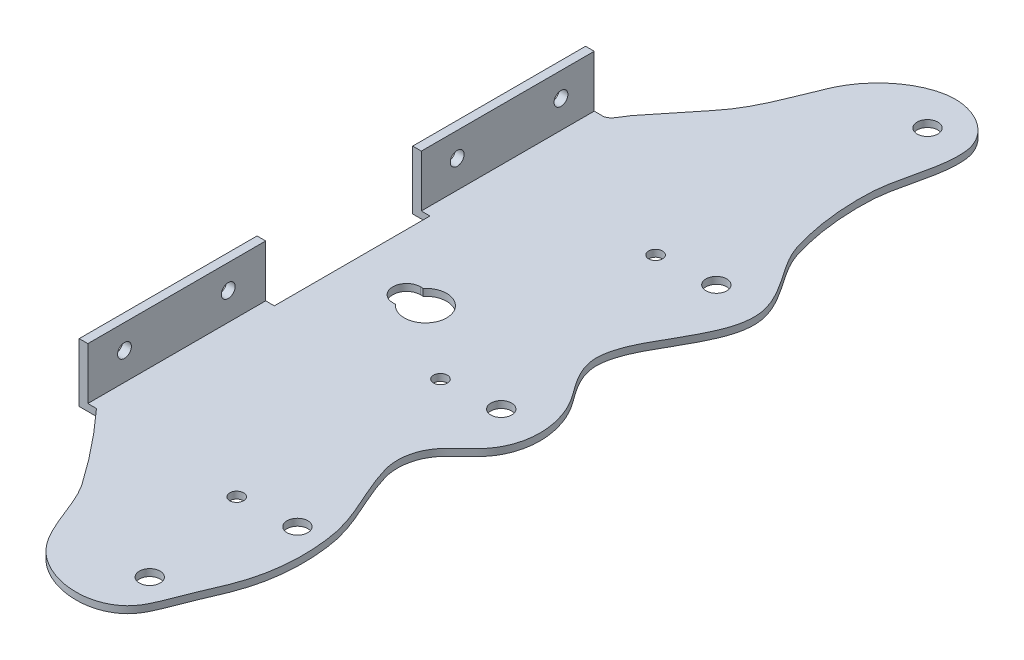
ISO-10303-21;
HEADER;
FILE_DESCRIPTION(('STEP AP214'),'2;1');
FILE_NAME('part.step','',(''),(''),'','','');
FILE_SCHEMA(('AUTOMOTIVE_DESIGN { 1 0 10303 214 1 1 1 1 }'));
ENDSEC;
DATA;
#1=APPLICATION_CONTEXT('core data for automotive mechanical design processes');
#2=APPLICATION_PROTOCOL_DEFINITION('international standard','automotive_design',2000,#1);
#3=PRODUCT_CONTEXT('',#1,'mechanical');
#4=PRODUCT('Part','Part','',(#3));
#5=PRODUCT_RELATED_PRODUCT_CATEGORY('part','',(#4));
#6=PRODUCT_DEFINITION_FORMATION('','',#4);
#7=PRODUCT_DEFINITION_CONTEXT('part definition',#1,'design');
#8=PRODUCT_DEFINITION('design','',#6,#7);
#9=PRODUCT_DEFINITION_SHAPE('','',#8);
#10=(LENGTH_UNIT() NAMED_UNIT(*) SI_UNIT(.MILLI.,.METRE.));
#11=(NAMED_UNIT(*) PLANE_ANGLE_UNIT() SI_UNIT($,.RADIAN.));
#12=(NAMED_UNIT(*) SI_UNIT($,.STERADIAN.) SOLID_ANGLE_UNIT());
#13=UNCERTAINTY_MEASURE_WITH_UNIT(LENGTH_MEASURE(1.E-05),#10,'distance_accuracy_value','');
#14=(GEOMETRIC_REPRESENTATION_CONTEXT(3) GLOBAL_UNCERTAINTY_ASSIGNED_CONTEXT((#13)) GLOBAL_UNIT_ASSIGNED_CONTEXT((#10,
#11,#12)) REPRESENTATION_CONTEXT('',''));
#15=CARTESIAN_POINT('',(0.,0.,0.));
#16=DIRECTION('',(0.,0.,1.));
#17=DIRECTION('',(1.,0.,0.));
#18=AXIS2_PLACEMENT_3D('',#15,#16,#17);
#19=CARTESIAN_POINT('',(255.661074439726,2.,-1028.80563383513));
#20=DIRECTION('',(0.,-1.,0.));
#21=DIRECTION('',(0.,0.,-1.));
#22=AXIS2_PLACEMENT_3D('',#19,#20,#21);
#23=PLANE('',#22);
#24=CARTESIAN_POINT('',(454.197507278282,2.,-1130.7574095105));
#25=DIRECTION('',(0.,1.,0.));
#26=DIRECTION('',(0.,0.,1.));
#27=AXIS2_PLACEMENT_3D('',#24,#25,#26);
#28=CIRCLE('',#27,2.99999999999999);
#29=CARTESIAN_POINT('',(454.197507278282,2.,-1127.7574095105));
#30=VERTEX_POINT('',#29);
#31=EDGE_CURVE('E478',#30,#30,#28,.T.);
#32=ORIENTED_EDGE('',*,*,#31,.F.);
#33=EDGE_LOOP('',(#32));
#34=FACE_BOUND('',#33,.T.);
#35=CARTESIAN_POINT('',(462.939861939,2.,-1164.71408522884));
#36=DIRECTION('',(0.,1.,0.));
#37=DIRECTION('',(0.,0.,1.));
#38=AXIS2_PLACEMENT_3D('',#35,#36,#37);
#39=CIRCLE('',#38,2.99999999999999);
#40=CARTESIAN_POINT('',(462.939861939,2.,-1161.71408522884));
#41=VERTEX_POINT('',#40);
#42=EDGE_CURVE('E472',#41,#41,#39,.T.);
#43=ORIENTED_EDGE('',*,*,#42,.F.);
#44=EDGE_LOOP('',(#43));
#45=FACE_BOUND('',#44,.T.);
#46=CARTESIAN_POINT('',(462.939861939,2.,-1223.64910089011));
#47=DIRECTION('',(0.,1.,0.));
#48=DIRECTION('',(0.,0.,1.));
#49=AXIS2_PLACEMENT_3D('',#46,#47,#48);
#50=CIRCLE('',#49,2.99999999999999);
#51=CARTESIAN_POINT('',(462.939861939,2.,-1220.64910089011));
#52=VERTEX_POINT('',#51);
#53=EDGE_CURVE('E469',#52,#52,#50,.T.);
#54=ORIENTED_EDGE('',*,*,#53,.F.);
#55=EDGE_LOOP('',(#54));
#56=FACE_BOUND('',#55,.T.);
#57=CARTESIAN_POINT('',(462.939861939,2.,-1285.84435146029));
#58=DIRECTION('',(0.,1.,0.));
#59=DIRECTION('',(0.,0.,1.));
#60=AXIS2_PLACEMENT_3D('',#57,#58,#59);
#61=CIRCLE('',#60,2.99999999999999);
#62=CARTESIAN_POINT('',(462.939861939,2.,-1282.84435146029));
#63=VERTEX_POINT('',#62);
#64=EDGE_CURVE('E473',#63,#63,#61,.T.);
#65=ORIENTED_EDGE('',*,*,#64,.F.);
#66=EDGE_LOOP('',(#65));
#67=FACE_BOUND('',#66,.T.);
#68=CARTESIAN_POINT('',(454.197507278282,2.,-1355.62910089056));
#69=DIRECTION('',(0.,1.,0.));
#70=DIRECTION('',(0.,0.,1.));
#71=AXIS2_PLACEMENT_3D('',#68,#69,#70);
#72=CIRCLE('',#71,2.99999999999999);
#73=CARTESIAN_POINT('',(454.197507278282,2.,-1352.62910089056));
#74=VERTEX_POINT('',#73);
#75=EDGE_CURVE('E481',#74,#74,#72,.T.);
#76=ORIENTED_EDGE('',*,*,#75,.F.);
#77=EDGE_LOOP('',(#76));
#78=FACE_BOUND('',#77,.T.);
#79=CARTESIAN_POINT('',(446.65971355284,2.,-1222.36199710261));
#80=DIRECTION('',(0.,1.,0.));
#81=DIRECTION('',(0.,0.,1.));
#82=AXIS2_PLACEMENT_3D('',#79,#80,#81);
#83=CIRCLE('',#82,2.);
#84=CARTESIAN_POINT('',(446.65971355284,2.,-1220.36199710261));
#85=VERTEX_POINT('',#84);
#86=EDGE_CURVE('E535',#85,#85,#83,.T.);
#87=ORIENTED_EDGE('',*,*,#86,.F.);
#88=EDGE_LOOP('',(#87));
#89=FACE_BOUND('',#88,.T.);
#90=CARTESIAN_POINT('',(446.65971355284,2.,-1163.42698144134));
#91=DIRECTION('',(0.,1.,0.));
#92=DIRECTION('',(0.,0.,1.));
#93=AXIS2_PLACEMENT_3D('',#90,#91,#92);
#94=CIRCLE('',#93,2.);
#95=CARTESIAN_POINT('',(446.65971355284,2.,-1161.42698144134));
#96=VERTEX_POINT('',#95);
#97=EDGE_CURVE('E185',#96,#96,#94,.T.);
#98=ORIENTED_EDGE('',*,*,#97,.F.);
#99=EDGE_LOOP('',(#98));
#100=FACE_BOUND('',#99,.T.);
#101=DIRECTION('',(-1.,0.,0.));
#102=VECTOR('',#101,1.);
#103=CARTESIAN_POINT('',(421.436838318646,2.,-1242.58627070393));
#104=LINE('',#103,#102);
#105=CARTESIAN_POINT('',(421.436838318646,2.,-1242.58627070393));
#106=VERTEX_POINT('',#105);
#107=CARTESIAN_POINT('',(420.648750920919,2.,-1242.58627070393));
#108=VERTEX_POINT('',#107);
#109=EDGE_CURVE('E205',#106,#108,#104,.T.);
#110=ORIENTED_EDGE('',*,*,#109,.F.);
#111=CARTESIAN_POINT('',(426.08968266473,2.,-1238.58627070393));
#112=DIRECTION('',(0.,-1.,0.));
#113=DIRECTION('',(0.,0.,-1.));
#114=AXIS2_PLACEMENT_3D('',#111,#112,#113);
#115=CIRCLE('',#114,6.13587487721889);
#116=CARTESIAN_POINT('',(421.436838318646,2.,-1234.58627070393));
#117=VERTEX_POINT('',#116);
#118=EDGE_CURVE('E167',#106,#117,#115,.T.);
#119=ORIENTED_EDGE('',*,*,#118,.T.);
#120=DIRECTION('',(1.,0.,0.));
#121=VECTOR('',#120,1.);
#122=CARTESIAN_POINT('',(420.648750920919,2.,-1234.58627070393));
#123=LINE('',#122,#121);
#124=CARTESIAN_POINT('',(420.64875092092,2.,-1234.58627070393));
#125=VERTEX_POINT('',#124);
#126=EDGE_CURVE('E201',#125,#117,#123,.T.);
#127=ORIENTED_EDGE('',*,*,#126,.F.);
#128=CARTESIAN_POINT('',(420.648750920919,2.,-1238.58627070393));
#129=DIRECTION('',(0.,1.,0.));
#130=DIRECTION('',(0.,0.,1.));
#131=AXIS2_PLACEMENT_3D('',#128,#129,#130);
#132=CIRCLE('',#131,4.);
#133=EDGE_CURVE('E63',#108,#125,#132,.T.);
#134=ORIENTED_EDGE('',*,*,#133,.F.);
#135=EDGE_LOOP('',(#110,#119,#127,#134));
#136=FACE_BOUND('',#135,.T.);
#137=DIRECTION('',(0.,0.,-1.));
#138=VECTOR('',#137,1.);
#139=CARTESIAN_POINT('',(401.796086460194,2.,-1216.68291310392));
#140=LINE('',#139,#138);
#141=CARTESIAN_POINT('',(401.796086460194,2.,-1165.26432310716));
#142=VERTEX_POINT('',#141);
#143=CARTESIAN_POINT('',(401.796086460194,2.,-1216.68291310392));
#144=VERTEX_POINT('',#143);
#145=EDGE_CURVE('E209',#142,#144,#140,.T.);
#146=ORIENTED_EDGE('',*,*,#145,.F.);
#147=DIRECTION('',(1.,0.,0.));
#148=VECTOR('',#147,1.);
#149=CARTESIAN_POINT('',(399.293679944663,2.,-1165.26432310716));
#150=LINE('',#149,#148);
#151=CARTESIAN_POINT('',(404.298492975727,2.,-1165.26432310716));
#152=VERTEX_POINT('',#151);
#153=EDGE_CURVE('E253',#142,#152,#150,.T.);
#154=ORIENTED_EDGE('',*,*,#153,.T.);
#155=CARTESIAN_POINT('',(255.661074439726,2.,-1028.80563383513));
#156=DIRECTION('',(0.,1.,0.));
#157=DIRECTION('',(0.,0.,-1.));
#158=AXIS2_PLACEMENT_3D('',#155,#156,#157);
#159=CIRCLE('',#158,201.777243679479);
#160=CARTESIAN_POINT('',(421.436838304636,2.,-1143.83803006286));
#161=VERTEX_POINT('',#160);
#162=EDGE_CURVE('E320',#161,#152,#159,.T.);
#163=ORIENTED_EDGE('',*,*,#162,.F.);
#164=CARTESIAN_POINT('',(404.298492975727,2.,-1311.68291310392));
#165=CARTESIAN_POINT('',(406.295600934266,2.,-1311.73670595974));
#166=CARTESIAN_POINT('',(407.085011737817,2.,-1314.44879871172));
#167=CARTESIAN_POINT('',(409.575192944788,2.,-1317.5434505828));
#168=CARTESIAN_POINT('',(410.820283548274,2.,-1319.09077651834));
#169=CARTESIAN_POINT('',(414.555555358731,2.,-1323.73275432495));
#170=CARTESIAN_POINT('',(417.064874752061,2.,-1326.79999933437));
#171=CARTESIAN_POINT('',(424.513235646728,2.,-1336.3101324201));
#172=CARTESIAN_POINT('',(426.853193629925,2.,-1344.04509664726));
#173=CARTESIAN_POINT('',(433.171429491688,2.,-1358.70777750479));
#174=CARTESIAN_POINT('',(440.246388319815,2.,-1365.15509536691));
#175=CARTESIAN_POINT('',(456.088524035443,2.,-1368.09341802965));
#176=CARTESIAN_POINT('',(464.999916661629,2.,-1362.93260796018));
#177=CARTESIAN_POINT('',(466.165817384064,2.,-1346.91506331004));
#178=CARTESIAN_POINT('',(462.473581677715,2.,-1339.19033657056));
#179=CARTESIAN_POINT('',(461.762695776429,2.,-1323.25818510204));
#180=CARTESIAN_POINT('',(462.721630003401,2.,-1315.29199422972));
#181=CARTESIAN_POINT('',(467.160419551933,2.,-1300.06745588101));
#182=CARTESIAN_POINT('',(474.17625309899,2.,-1294.50552442475));
#183=CARTESIAN_POINT('',(477.954929379964,2.,-1278.72367697068));
#184=CARTESIAN_POINT('',(472.734514964729,2.,-1270.97658607166));
#185=CARTESIAN_POINT('',(465.105690644388,2.,-1257.2724683784));
#186=CARTESIAN_POINT('',(463.326944585366,2.,-1252.4305742544));
#187=CARTESIAN_POINT('',(464.721292468545,2.,-1244.26561835925));
#188=CARTESIAN_POINT('',(467.324164939411,2.,-1240.80520416999));
#189=CARTESIAN_POINT('',(474.859619179385,2.,-1230.45901557285));
#190=CARTESIAN_POINT('',(476.348995327918,2.,-1220.80819832412));
#191=CARTESIAN_POINT('',(469.715777811257,2.,-1209.81143323898));
#192=CARTESIAN_POINT('',(465.878031568866,2.,-1207.57126665351));
#193=CARTESIAN_POINT('',(460.805018265854,2.,-1200.61149649099));
#194=CARTESIAN_POINT('',(460.133507775431,2.,-1195.93397954467));
#195=CARTESIAN_POINT('',(463.620047448152,2.,-1183.54943758628));
#196=CARTESIAN_POINT('',(468.654313929908,2.,-1176.213189786));
#197=CARTESIAN_POINT('',(471.504835360422,2.,-1159.35233282218));
#198=CARTESIAN_POINT('',(471.10454470028,2.,-1150.51786853807));
#199=CARTESIAN_POINT('',(466.884735434399,2.,-1138.41732568748));
#200=CARTESIAN_POINT('',(465.012012783357,2.,-1134.57344816104));
#201=CARTESIAN_POINT('',(461.842122723715,2.,-1126.61511106856));
#202=CARTESIAN_POINT('',(460.633411015589,2.,-1122.17984978088));
#203=CARTESIAN_POINT('',(450.489854867589,2.,-1114.24592382287));
#204=CARTESIAN_POINT('',(439.660076739881,2.,-1115.94459527402));
#205=CARTESIAN_POINT('',(427.144129501304,2.,-1127.18007234506));
#206=CARTESIAN_POINT('',(426.027987251622,2.,-1136.67754395337));
#207=CARTESIAN_POINT('',(421.436838304636,2.,-1143.83803006286));
#208=B_SPLINE_CURVE_WITH_KNOTS('',3,(#164,#165,#166,#167,#168,#169,#170,#171,#172,#173,#174,
#175,#176,#177,#178,#179,#180,#181,#182,#183,#184,#185,#186,#187,#188,#189,#190,#191,#192,#193,
#194,#195,#196,#197,#198,#199,#200,#201,#202,#203,#204,#205,#206,#207),.UNSPECIFIED.,.F.,.F.,(4,
2,2,2,2,2,2,2,2,2,2,2,2,2,2,2,2,2,2,2,2,4),(0.,0.0156249999999999,0.0312499999999998,
0.0625000000000006,0.125000000000001,0.187500000000001,0.250000000000002,0.312500000000002,
0.375000000000002,0.437500000000003,0.500000000000003,0.531250000000003,0.562500000000003,
0.625000000000004,0.656250000000003,0.687500000000003,0.750000000000001,0.8125,
0.843750000000001,0.875000000000001,0.9375,1.),.UNSPECIFIED.);
#209=CARTESIAN_POINT('',(404.298492975727,2.,-1311.68291310392));
#210=VERTEX_POINT('',#209);
#211=EDGE_CURVE('E328',#210,#161,#208,.T.);
#212=ORIENTED_EDGE('',*,*,#211,.F.);
#213=DIRECTION('',(1.,0.,0.));
#214=VECTOR('',#213,1.);
#215=CARTESIAN_POINT('',(399.293679944663,2.,-1311.68291310392));
#216=LINE('',#215,#214);
#217=CARTESIAN_POINT('',(401.796086460194,2.,-1311.68291310392));
#218=VERTEX_POINT('',#217);
#219=EDGE_CURVE('E301',#218,#210,#216,.T.);
#220=ORIENTED_EDGE('',*,*,#219,.F.);
#221=DIRECTION('',(0.,0.,-1.));
#222=VECTOR('',#221,1.);
#223=CARTESIAN_POINT('',(401.796086460194,2.,-1311.68291310392));
#224=LINE('',#223,#222);
#225=CARTESIAN_POINT('',(401.796086460194,2.,-1261.68291310392));
#226=VERTEX_POINT('',#225);
#227=EDGE_CURVE('E263',#226,#218,#224,.T.);
#228=ORIENTED_EDGE('',*,*,#227,.F.);
#229=DIRECTION('',(1.,0.,0.));
#230=VECTOR('',#229,1.);
#231=CARTESIAN_POINT('',(399.293679944663,2.,-1261.68291310392));
#232=LINE('',#231,#230);
#233=CARTESIAN_POINT('',(404.298492975727,2.,-1261.68291310392));
#234=VERTEX_POINT('',#233);
#235=EDGE_CURVE('E307',#226,#234,#232,.T.);
#236=ORIENTED_EDGE('',*,*,#235,.T.);
#237=DIRECTION('',(0.,0.,-1.));
#238=VECTOR('',#237,1.);
#239=CARTESIAN_POINT('',(404.298492975727,2.,-1165.26432310716));
#240=LINE('',#239,#238);
#241=CARTESIAN_POINT('',(404.298492975727,2.,-1216.68291310392));
#242=VERTEX_POINT('',#241);
#243=EDGE_CURVE('E324',#242,#234,#240,.T.);
#244=ORIENTED_EDGE('',*,*,#243,.F.);
#245=DIRECTION('',(1.,0.,0.));
#246=VECTOR('',#245,1.);
#247=CARTESIAN_POINT('',(399.293679944663,2.,-1216.68291310392));
#248=LINE('',#247,#246);
#249=EDGE_CURVE('E248',#144,#242,#248,.T.);
#250=ORIENTED_EDGE('',*,*,#249,.F.);
#251=EDGE_LOOP('',(#146,#154,#163,#212,#220,#228,#236,#244,#250));
#252=FACE_BOUND('',#251,.T.);
#253=CARTESIAN_POINT('',(446.65971355284,2.,-1284.55724767279));
#254=DIRECTION('',(0.,1.,0.));
#255=DIRECTION('',(0.,0.,1.));
#256=AXIS2_PLACEMENT_3D('',#253,#254,#255);
#257=CIRCLE('',#256,2.);
#258=CARTESIAN_POINT('',(446.65971355284,2.,-1282.55724767279));
#259=VERTEX_POINT('',#258);
#260=EDGE_CURVE('E539',#259,#259,#257,.T.);
#261=ORIENTED_EDGE('',*,*,#260,.F.);
#262=EDGE_LOOP('',(#261));
#263=FACE_BOUND('',#262,.T.);
#264=ADVANCED_FACE('F45',(#34,#45,#56,#67,#78,#89,#100,#136,#252,#263),#23,.F.);
#265=CARTESIAN_POINT('',(255.661074439726,0.,-1028.80563383513));
#266=DIRECTION('',(0.,-1.,0.));
#267=DIRECTION('',(0.,0.,-1.));
#268=AXIS2_PLACEMENT_3D('',#265,#266,#267);
#269=PLANE('',#268);
#270=CARTESIAN_POINT('',(446.65971355284,0.,-1222.36199710261));
#271=DIRECTION('',(0.,-1.,0.));
#272=DIRECTION('',(0.,0.,-1.));
#273=AXIS2_PLACEMENT_3D('',#270,#271,#272);
#274=CIRCLE('',#273,2.);
#275=CARTESIAN_POINT('',(446.65971355284,0.,-1224.36199710261));
#276=VERTEX_POINT('',#275);
#277=EDGE_CURVE('E489',#276,#276,#274,.T.);
#278=ORIENTED_EDGE('',*,*,#277,.F.);
#279=EDGE_LOOP('',(#278));
#280=FACE_BOUND('',#279,.T.);
#281=CARTESIAN_POINT('',(446.65971355284,0.,-1163.42698144134));
#282=DIRECTION('',(0.,-1.,0.));
#283=DIRECTION('',(0.,0.,-1.));
#284=AXIS2_PLACEMENT_3D('',#281,#282,#283);
#285=CIRCLE('',#284,2.);
#286=CARTESIAN_POINT('',(446.65971355284,0.,-1165.42698144134));
#287=VERTEX_POINT('',#286);
#288=EDGE_CURVE('E498',#287,#287,#285,.T.);
#289=ORIENTED_EDGE('',*,*,#288,.F.);
#290=EDGE_LOOP('',(#289));
#291=FACE_BOUND('',#290,.T.);
#292=CARTESIAN_POINT('',(454.197507278282,0.,-1130.7574095105));
#293=DIRECTION('',(0.,-1.,0.));
#294=DIRECTION('',(0.,0.,-1.));
#295=AXIS2_PLACEMENT_3D('',#292,#293,#294);
#296=CIRCLE('',#295,2.99999999999999);
#297=CARTESIAN_POINT('',(454.197507278282,0.,-1133.7574095105));
#298=VERTEX_POINT('',#297);
#299=EDGE_CURVE('E49',#298,#298,#296,.T.);
#300=ORIENTED_EDGE('',*,*,#299,.F.);
#301=EDGE_LOOP('',(#300));
#302=FACE_BOUND('',#301,.T.);
#303=CARTESIAN_POINT('',(462.939861939,0.,-1164.71408522884));
#304=DIRECTION('',(0.,-1.,0.));
#305=DIRECTION('',(0.,0.,-1.));
#306=AXIS2_PLACEMENT_3D('',#303,#304,#305);
#307=CIRCLE('',#306,2.99999999999999);
#308=CARTESIAN_POINT('',(462.939861939,0.,-1167.71408522884));
#309=VERTEX_POINT('',#308);
#310=EDGE_CURVE('E591',#309,#309,#307,.T.);
#311=ORIENTED_EDGE('',*,*,#310,.F.);
#312=EDGE_LOOP('',(#311));
#313=FACE_BOUND('',#312,.T.);
#314=CARTESIAN_POINT('',(462.939861939,0.,-1223.64910089011));
#315=DIRECTION('',(0.,-1.,0.));
#316=DIRECTION('',(0.,0.,-1.));
#317=AXIS2_PLACEMENT_3D('',#314,#315,#316);
#318=CIRCLE('',#317,2.99999999999999);
#319=CARTESIAN_POINT('',(462.939861939,0.,-1226.64910089011));
#320=VERTEX_POINT('',#319);
#321=EDGE_CURVE('E466',#320,#320,#318,.T.);
#322=ORIENTED_EDGE('',*,*,#321,.F.);
#323=EDGE_LOOP('',(#322));
#324=FACE_BOUND('',#323,.T.);
#325=CARTESIAN_POINT('',(462.939861939,0.,-1285.84435146029));
#326=DIRECTION('',(0.,-1.,0.));
#327=DIRECTION('',(0.,0.,-1.));
#328=AXIS2_PLACEMENT_3D('',#325,#326,#327);
#329=CIRCLE('',#328,2.99999999999999);
#330=CARTESIAN_POINT('',(462.939861939,0.,-1288.84435146029));
#331=VERTEX_POINT('',#330);
#332=EDGE_CURVE('E586',#331,#331,#329,.T.);
#333=ORIENTED_EDGE('',*,*,#332,.F.);
#334=EDGE_LOOP('',(#333));
#335=FACE_BOUND('',#334,.T.);
#336=CARTESIAN_POINT('',(454.197507278282,0.,-1355.62910089056));
#337=DIRECTION('',(0.,-1.,0.));
#338=DIRECTION('',(0.,0.,-1.));
#339=AXIS2_PLACEMENT_3D('',#336,#337,#338);
#340=CIRCLE('',#339,2.99999999999999);
#341=CARTESIAN_POINT('',(454.197507278282,0.,-1358.62910089056));
#342=VERTEX_POINT('',#341);
#343=EDGE_CURVE('E502',#342,#342,#340,.T.);
#344=ORIENTED_EDGE('',*,*,#343,.F.);
#345=EDGE_LOOP('',(#344));
#346=FACE_BOUND('',#345,.T.);
#347=CARTESIAN_POINT('',(446.65971355284,0.,-1284.55724767279));
#348=DIRECTION('',(0.,-1.,0.));
#349=DIRECTION('',(0.,0.,-1.));
#350=AXIS2_PLACEMENT_3D('',#347,#348,#349);
#351=CIRCLE('',#350,2.);
#352=CARTESIAN_POINT('',(446.65971355284,0.,-1286.55724767279));
#353=VERTEX_POINT('',#352);
#354=EDGE_CURVE('E494',#353,#353,#351,.T.);
#355=ORIENTED_EDGE('',*,*,#354,.F.);
#356=EDGE_LOOP('',(#355));
#357=FACE_BOUND('',#356,.T.);
#358=CARTESIAN_POINT('',(255.661074439726,0.,-1028.80563383513));
#359=DIRECTION('',(0.,1.,0.));
#360=DIRECTION('',(0.,0.,-1.));
#361=AXIS2_PLACEMENT_3D('',#358,#359,#360);
#362=CIRCLE('',#361,201.777243679479);
#363=CARTESIAN_POINT('',(421.436838304636,0.,-1143.83803006286));
#364=VERTEX_POINT('',#363);
#365=CARTESIAN_POINT('',(404.298492975727,0.,-1165.26432310716));
#366=VERTEX_POINT('',#365);
#367=EDGE_CURVE('E319',#364,#366,#362,.T.);
#368=ORIENTED_EDGE('',*,*,#367,.T.);
#369=DIRECTION('',(1.,0.,0.));
#370=VECTOR('',#369,1.);
#371=CARTESIAN_POINT('',(399.293679944663,0.,-1165.26432310716));
#372=LINE('',#371,#370);
#373=CARTESIAN_POINT('',(399.293679944663,0.,-1165.26432310716));
#374=VERTEX_POINT('',#373);
#375=EDGE_CURVE('E256',#374,#366,#372,.T.);
#376=ORIENTED_EDGE('',*,*,#375,.F.);
#377=DIRECTION('',(0.,0.,1.));
#378=VECTOR('',#377,1.);
#379=CARTESIAN_POINT('',(399.293679944663,0.,-1165.26432310716));
#380=LINE('',#379,#378);
#381=CARTESIAN_POINT('',(399.293679944663,0.,-1216.68291310392));
#382=VERTEX_POINT('',#381);
#383=EDGE_CURVE('E242',#382,#374,#380,.T.);
#384=ORIENTED_EDGE('',*,*,#383,.F.);
#385=DIRECTION('',(1.,0.,0.));
#386=VECTOR('',#385,1.);
#387=CARTESIAN_POINT('',(399.293679944663,0.,-1216.68291310392));
#388=LINE('',#387,#386);
#389=CARTESIAN_POINT('',(404.298492975727,0.,-1216.68291310392));
#390=VERTEX_POINT('',#389);
#391=EDGE_CURVE('E259',#382,#390,#388,.T.);
#392=ORIENTED_EDGE('',*,*,#391,.T.);
#393=DIRECTION('',(0.,0.,-1.));
#394=VECTOR('',#393,1.);
#395=CARTESIAN_POINT('',(404.298492975727,0.,-1165.26432310716));
#396=LINE('',#395,#394);
#397=CARTESIAN_POINT('',(404.298492975727,0.,-1261.68291310392));
#398=VERTEX_POINT('',#397);
#399=EDGE_CURVE('E568',#390,#398,#396,.T.);
#400=ORIENTED_EDGE('',*,*,#399,.T.);
#401=DIRECTION('',(1.,0.,0.));
#402=VECTOR('',#401,1.);
#403=CARTESIAN_POINT('',(399.293679944663,0.,-1261.68291310392));
#404=LINE('',#403,#402);
#405=CARTESIAN_POINT('',(399.293679944663,0.,-1261.68291310392));
#406=VERTEX_POINT('',#405);
#407=EDGE_CURVE('E311',#406,#398,#404,.T.);
#408=ORIENTED_EDGE('',*,*,#407,.F.);
#409=DIRECTION('',(0.,0.,1.));
#410=VECTOR('',#409,1.);
#411=CARTESIAN_POINT('',(399.293679944663,0.,-1261.68291310392));
#412=LINE('',#411,#410);
#413=CARTESIAN_POINT('',(399.293679944663,0.,-1311.68291310392));
#414=VERTEX_POINT('',#413);
#415=EDGE_CURVE('E295',#414,#406,#412,.T.);
#416=ORIENTED_EDGE('',*,*,#415,.F.);
#417=DIRECTION('',(1.,0.,0.));
#418=VECTOR('',#417,1.);
#419=CARTESIAN_POINT('',(399.293679944663,0.,-1311.68291310392));
#420=LINE('',#419,#418);
#421=CARTESIAN_POINT('',(404.298492975727,0.,-1311.68291310392));
#422=VERTEX_POINT('',#421);
#423=EDGE_CURVE('E315',#414,#422,#420,.T.);
#424=ORIENTED_EDGE('',*,*,#423,.T.);
#425=CARTESIAN_POINT('',(404.298492975727,0.,-1311.68291310392));
#426=CARTESIAN_POINT('',(406.295600934266,0.,-1311.73670595974));
#427=CARTESIAN_POINT('',(407.085011737817,0.,-1314.44879871172));
#428=CARTESIAN_POINT('',(409.575192944788,0.,-1317.5434505828));
#429=CARTESIAN_POINT('',(410.820283548274,0.,-1319.09077651834));
#430=CARTESIAN_POINT('',(414.555555358731,0.,-1323.73275432495));
#431=CARTESIAN_POINT('',(417.064874752061,0.,-1326.79999933437));
#432=CARTESIAN_POINT('',(424.513235646728,0.,-1336.3101324201));
#433=CARTESIAN_POINT('',(426.853193629925,0.,-1344.04509664726));
#434=CARTESIAN_POINT('',(433.171429491688,0.,-1358.70777750479));
#435=CARTESIAN_POINT('',(440.246388319815,0.,-1365.15509536691));
#436=CARTESIAN_POINT('',(456.088524035443,0.,-1368.09341802965));
#437=CARTESIAN_POINT('',(464.999916661629,0.,-1362.93260796018));
#438=CARTESIAN_POINT('',(466.165817384064,0.,-1346.91506331004));
#439=CARTESIAN_POINT('',(462.473581677715,0.,-1339.19033657056));
#440=CARTESIAN_POINT('',(461.762695776429,0.,-1323.25818510204));
#441=CARTESIAN_POINT('',(462.721630003401,0.,-1315.29199422972));
#442=CARTESIAN_POINT('',(467.160419551933,0.,-1300.06745588101));
#443=CARTESIAN_POINT('',(474.17625309899,0.,-1294.50552442475));
#444=CARTESIAN_POINT('',(477.954929379964,0.,-1278.72367697068));
#445=CARTESIAN_POINT('',(472.734514964729,0.,-1270.97658607166));
#446=CARTESIAN_POINT('',(465.105690644388,0.,-1257.2724683784));
#447=CARTESIAN_POINT('',(463.326944585366,0.,-1252.4305742544));
#448=CARTESIAN_POINT('',(464.721292468545,0.,-1244.26561835925));
#449=CARTESIAN_POINT('',(467.324164939411,0.,-1240.80520416999));
#450=CARTESIAN_POINT('',(474.859619179385,0.,-1230.45901557285));
#451=CARTESIAN_POINT('',(476.348995327918,0.,-1220.80819832412));
#452=CARTESIAN_POINT('',(469.715777811257,0.,-1209.81143323898));
#453=CARTESIAN_POINT('',(465.878031568866,0.,-1207.57126665351));
#454=CARTESIAN_POINT('',(460.805018265854,0.,-1200.61149649099));
#455=CARTESIAN_POINT('',(460.133507775431,0.,-1195.93397954467));
#456=CARTESIAN_POINT('',(463.620047448152,0.,-1183.54943758628));
#457=CARTESIAN_POINT('',(468.654313929908,0.,-1176.213189786));
#458=CARTESIAN_POINT('',(471.504835360422,0.,-1159.35233282218));
#459=CARTESIAN_POINT('',(471.10454470028,0.,-1150.51786853807));
#460=CARTESIAN_POINT('',(466.884735434399,0.,-1138.41732568748));
#461=CARTESIAN_POINT('',(465.012012783357,0.,-1134.57344816104));
#462=CARTESIAN_POINT('',(461.842122723715,0.,-1126.61511106856));
#463=CARTESIAN_POINT('',(460.633411015589,0.,-1122.17984978088));
#464=CARTESIAN_POINT('',(450.489854867589,0.,-1114.24592382287));
#465=CARTESIAN_POINT('',(439.660076739881,0.,-1115.94459527402));
#466=CARTESIAN_POINT('',(427.144129501304,0.,-1127.18007234506));
#467=CARTESIAN_POINT('',(426.027987251622,0.,-1136.67754395337));
#468=CARTESIAN_POINT('',(421.436838304636,0.,-1143.83803006286));
#469=B_SPLINE_CURVE_WITH_KNOTS('',3,(#425,#426,#427,#428,#429,#430,#431,#432,#433,#434,#435,
#436,#437,#438,#439,#440,#441,#442,#443,#444,#445,#446,#447,#448,#449,#450,#451,#452,#453,#454,
#455,#456,#457,#458,#459,#460,#461,#462,#463,#464,#465,#466,#467,#468),.UNSPECIFIED.,.F.,.F.,(4,
2,2,2,2,2,2,2,2,2,2,2,2,2,2,2,2,2,2,2,2,4),(0.,0.0156249999999999,0.0312499999999998,
0.0625000000000006,0.125000000000001,0.187500000000001,0.250000000000002,0.312500000000002,
0.375000000000002,0.437500000000003,0.500000000000003,0.531250000000003,0.562500000000003,
0.625000000000004,0.656250000000003,0.687500000000003,0.750000000000001,0.8125,
0.843750000000001,0.875000000000001,0.9375,1.),.UNSPECIFIED.);
#470=EDGE_CURVE('E325',#422,#364,#469,.T.);
#471=ORIENTED_EDGE('',*,*,#470,.T.);
#472=EDGE_LOOP('',(#368,#376,#384,#392,#400,#408,#416,#424,#471));
#473=FACE_BOUND('',#472,.T.);
#474=CARTESIAN_POINT('',(426.08968266473,0.,-1238.58627070393));
#475=DIRECTION('',(0.,-1.,0.));
#476=DIRECTION('',(0.,0.,-1.));
#477=AXIS2_PLACEMENT_3D('',#474,#475,#476);
#478=CIRCLE('',#477,6.13587487721889);
#479=CARTESIAN_POINT('',(421.436838318646,0.,-1242.58627070393));
#480=VERTEX_POINT('',#479);
#481=CARTESIAN_POINT('',(421.436838318646,0.,-1234.58627070393));
#482=VERTEX_POINT('',#481);
#483=EDGE_CURVE('E71',#480,#482,#478,.T.);
#484=ORIENTED_EDGE('',*,*,#483,.F.);
#485=DIRECTION('',(-1.,0.,0.));
#486=VECTOR('',#485,1.);
#487=CARTESIAN_POINT('',(421.436838318646,0.,-1242.58627070393));
#488=LINE('',#487,#486);
#489=CARTESIAN_POINT('',(420.648750920919,0.,-1242.58627070393));
#490=VERTEX_POINT('',#489);
#491=EDGE_CURVE('E181',#480,#490,#488,.T.);
#492=ORIENTED_EDGE('',*,*,#491,.T.);
#493=CARTESIAN_POINT('',(420.648750920919,0.,-1238.58627070393));
#494=DIRECTION('',(0.,1.,0.));
#495=DIRECTION('',(0.,0.,1.));
#496=AXIS2_PLACEMENT_3D('',#493,#494,#495);
#497=CIRCLE('',#496,4.);
#498=CARTESIAN_POINT('',(420.648750920919,0.,-1234.58627070393));
#499=VERTEX_POINT('',#498);
#500=EDGE_CURVE('E195',#490,#499,#497,.T.);
#501=ORIENTED_EDGE('',*,*,#500,.T.);
#502=DIRECTION('',(1.,0.,0.));
#503=VECTOR('',#502,1.);
#504=CARTESIAN_POINT('',(420.648750920919,0.,-1234.58627070393));
#505=LINE('',#504,#503);
#506=EDGE_CURVE('E183',#499,#482,#505,.T.);
#507=ORIENTED_EDGE('',*,*,#506,.T.);
#508=EDGE_LOOP('',(#484,#492,#501,#507));
#509=FACE_BOUND('',#508,.T.);
#510=ADVANCED_FACE('F179',(#280,#291,#302,#313,#324,#335,#346,#357,#473,#509),#269,.T.);
#511=CARTESIAN_POINT('',(404.298492975727,2.,-1165.26432310716));
#512=DIRECTION('',(-1.,0.,0.));
#513=DIRECTION('',(0.,0.,1.));
#514=AXIS2_PLACEMENT_3D('',#511,#512,#513);
#515=PLANE('',#514);
#516=ORIENTED_EDGE('',*,*,#399,.F.);
#517=DIRECTION('',(0.,-1.,0.));
#518=VECTOR('',#517,1.);
#519=CARTESIAN_POINT('',(404.298492975727,0.,-1216.68291310392));
#520=LINE('',#519,#518);
#521=EDGE_CURVE('E237',#242,#390,#520,.T.);
#522=ORIENTED_EDGE('',*,*,#521,.F.);
#523=ORIENTED_EDGE('',*,*,#243,.T.);
#524=DIRECTION('',(0.,1.,0.));
#525=VECTOR('',#524,1.);
#526=CARTESIAN_POINT('',(404.298492975727,2.,-1261.68291310392));
#527=LINE('',#526,#525);
#528=EDGE_CURVE('E290',#398,#234,#527,.T.);
#529=ORIENTED_EDGE('',*,*,#528,.F.);
#530=EDGE_LOOP('',(#516,#522,#523,#529));
#531=FACE_BOUND('',#530,.T.);
#532=ADVANCED_FACE('F347',(#531),#515,.T.);
#533=CARTESIAN_POINT('',(255.661074439726,2.,-1028.80563383513));
#534=DIRECTION('',(0.,-1.,0.));
#535=DIRECTION('',(0.,0.,-1.));
#536=AXIS2_PLACEMENT_3D('',#533,#534,#535);
#537=CYLINDRICAL_SURFACE('',#536,201.777243679479);
#538=ORIENTED_EDGE('',*,*,#367,.F.);
#539=DIRECTION('',(0.,-1.,0.));
#540=VECTOR('',#539,1.);
#541=CARTESIAN_POINT('',(421.436838304636,2.,-1143.83803006286));
#542=LINE('',#541,#540);
#543=EDGE_CURVE('E11',#161,#364,#542,.T.);
#544=ORIENTED_EDGE('',*,*,#543,.F.);
#545=ORIENTED_EDGE('',*,*,#162,.T.);
#546=DIRECTION('',(0.,-1.,0.));
#547=VECTOR('',#546,1.);
#548=CARTESIAN_POINT('',(404.298492975727,2.,-1165.26432310716));
#549=LINE('',#548,#547);
#550=EDGE_CURVE('E335',#152,#366,#549,.T.);
#551=ORIENTED_EDGE('',*,*,#550,.T.);
#552=EDGE_LOOP('',(#538,#544,#545,#551));
#553=FACE_BOUND('',#552,.T.);
#554=ADVANCED_FACE('F47',(#553),#537,.F.);
#555=DIRECTION('',(0.,-1.,0.));
#556=VECTOR('',#555,1.);
#557=SURFACE_OF_LINEAR_EXTRUSION('',#208,#556);
#558=ORIENTED_EDGE('',*,*,#470,.F.);
#559=DIRECTION('',(0.,-1.,0.));
#560=VECTOR('',#559,1.);
#561=CARTESIAN_POINT('',(404.298492975727,2.,-1311.68291310392));
#562=LINE('',#561,#560);
#563=EDGE_CURVE('E55',#210,#422,#562,.T.);
#564=ORIENTED_EDGE('',*,*,#563,.F.);
#565=ORIENTED_EDGE('',*,*,#211,.T.);
#566=ORIENTED_EDGE('',*,*,#543,.T.);
#567=EDGE_LOOP('',(#558,#564,#565,#566));
#568=FACE_BOUND('',#567,.T.);
#569=ADVANCED_FACE('F341',(#568),#557,.T.);
#570=CARTESIAN_POINT('',(399.293679944663,0.,-1311.68291310392));
#571=DIRECTION('',(0.,0.,1.));
#572=DIRECTION('',(1.,0.,0.));
#573=AXIS2_PLACEMENT_3D('',#570,#571,#572);
#574=PLANE('',#573);
#575=ORIENTED_EDGE('',*,*,#563,.T.);
#576=ORIENTED_EDGE('',*,*,#423,.F.);
#577=DIRECTION('',(0.,-1.,0.));
#578=VECTOR('',#577,1.);
#579=CARTESIAN_POINT('',(399.293679944663,0.,-1311.68291310392));
#580=LINE('',#579,#578);
#581=CARTESIAN_POINT('',(399.293679944663,17.,-1311.68291310392));
#582=VERTEX_POINT('',#581);
#583=EDGE_CURVE('E291',#582,#414,#580,.T.);
#584=ORIENTED_EDGE('',*,*,#583,.F.);
#585=DIRECTION('',(-1.,0.,0.));
#586=VECTOR('',#585,1.);
#587=CARTESIAN_POINT('',(399.293679944663,17.,-1311.68291310392));
#588=LINE('',#587,#586);
#589=CARTESIAN_POINT('',(401.796086460194,17.,-1311.68291310392));
#590=VERTEX_POINT('',#589);
#591=EDGE_CURVE('E271',#590,#582,#588,.T.);
#592=ORIENTED_EDGE('',*,*,#591,.F.);
#593=DIRECTION('',(0.,-1.,0.));
#594=VECTOR('',#593,1.);
#595=CARTESIAN_POINT('',(401.796086460194,17.,-1311.68291310392));
#596=LINE('',#595,#594);
#597=EDGE_CURVE('E279',#590,#218,#596,.T.);
#598=ORIENTED_EDGE('',*,*,#597,.T.);
#599=ORIENTED_EDGE('',*,*,#219,.T.);
#600=EDGE_LOOP('',(#575,#576,#584,#592,#598,#599));
#601=FACE_BOUND('',#600,.T.);
#602=ADVANCED_FACE('F344',(#601),#574,.F.);
#603=CARTESIAN_POINT('',(399.293679944663,2.,-1261.68291310392));
#604=DIRECTION('',(0.,0.,-1.));
#605=DIRECTION('',(-1.,0.,0.));
#606=AXIS2_PLACEMENT_3D('',#603,#604,#605);
#607=PLANE('',#606);
#608=ORIENTED_EDGE('',*,*,#528,.T.);
#609=ORIENTED_EDGE('',*,*,#235,.F.);
#610=DIRECTION('',(0.,-1.,0.));
#611=VECTOR('',#610,1.);
#612=CARTESIAN_POINT('',(401.796086460194,17.,-1261.68291310392));
#613=LINE('',#612,#611);
#614=CARTESIAN_POINT('',(401.796086460194,17.,-1261.68291310392));
#615=VERTEX_POINT('',#614);
#616=EDGE_CURVE('E286',#615,#226,#613,.T.);
#617=ORIENTED_EDGE('',*,*,#616,.F.);
#618=DIRECTION('',(1.,0.,0.));
#619=VECTOR('',#618,1.);
#620=CARTESIAN_POINT('',(401.796086460194,17.,-1261.68291310392));
#621=LINE('',#620,#619);
#622=CARTESIAN_POINT('',(399.293679944663,17.,-1261.68291310392));
#623=VERTEX_POINT('',#622);
#624=EDGE_CURVE('E264',#623,#615,#621,.T.);
#625=ORIENTED_EDGE('',*,*,#624,.F.);
#626=DIRECTION('',(0.,1.,0.));
#627=VECTOR('',#626,1.);
#628=CARTESIAN_POINT('',(399.293679944663,2.,-1261.68291310392));
#629=LINE('',#628,#627);
#630=EDGE_CURVE('E298',#406,#623,#629,.T.);
#631=ORIENTED_EDGE('',*,*,#630,.F.);
#632=ORIENTED_EDGE('',*,*,#407,.T.);
#633=EDGE_LOOP('',(#608,#609,#617,#625,#631,#632));
#634=FACE_BOUND('',#633,.T.);
#635=ADVANCED_FACE('F368',(#634),#607,.F.);
#636=CARTESIAN_POINT('',(399.293679944663,0.,0.));
#637=DIRECTION('',(1.,0.,0.));
#638=DIRECTION('',(0.,0.,-1.));
#639=AXIS2_PLACEMENT_3D('',#636,#637,#638);
#640=PLANE('',#639);
#641=CARTESIAN_POINT('',(399.293679944663,10.,-1272.05583404728));
#642=DIRECTION('',(1.,0.,0.));
#643=DIRECTION('',(0.,0.,-1.));
#644=AXIS2_PLACEMENT_3D('',#641,#642,#643);
#645=CIRCLE('',#644,1.99999999999999);
#646=CARTESIAN_POINT('',(399.293679944663,10.,-1274.05583404728));
#647=VERTEX_POINT('',#646);
#648=EDGE_CURVE('E507',#647,#647,#645,.T.);
#649=ORIENTED_EDGE('',*,*,#648,.T.);
#650=EDGE_LOOP('',(#649));
#651=FACE_BOUND('',#650,.T.);
#652=CARTESIAN_POINT('',(399.293679944663,10.,-1302.05583404728));
#653=DIRECTION('',(1.,0.,0.));
#654=DIRECTION('',(0.,0.,-1.));
#655=AXIS2_PLACEMENT_3D('',#652,#653,#654);
#656=CIRCLE('',#655,1.99999999999999);
#657=CARTESIAN_POINT('',(399.293679944663,10.,-1304.05583404728));
#658=VERTEX_POINT('',#657);
#659=EDGE_CURVE('E515',#658,#658,#656,.T.);
#660=ORIENTED_EDGE('',*,*,#659,.T.);
#661=EDGE_LOOP('',(#660));
#662=FACE_BOUND('',#661,.T.);
#663=ORIENTED_EDGE('',*,*,#583,.T.);
#664=ORIENTED_EDGE('',*,*,#415,.T.);
#665=ORIENTED_EDGE('',*,*,#630,.T.);
#666=DIRECTION('',(0.,0.,1.));
#667=VECTOR('',#666,1.);
#668=CARTESIAN_POINT('',(399.293679944663,17.,-1261.68291310392));
#669=LINE('',#668,#667);
#670=EDGE_CURVE('E275',#582,#623,#669,.T.);
#671=ORIENTED_EDGE('',*,*,#670,.F.);
#672=EDGE_LOOP('',(#663,#664,#665,#671));
#673=FACE_BOUND('',#672,.T.);
#674=ADVANCED_FACE('F372',(#651,#662,#673),#640,.F.);
#675=CARTESIAN_POINT('',(401.796086460194,17.,-1311.68291310392));
#676=DIRECTION('',(-1.,0.,0.));
#677=DIRECTION('',(0.,0.,1.));
#678=AXIS2_PLACEMENT_3D('',#675,#676,#677);
#679=PLANE('',#678);
#680=CARTESIAN_POINT('',(401.796086460194,10.,-1272.05583404728));
#681=DIRECTION('',(1.,0.,0.));
#682=DIRECTION('',(0.,0.,-1.));
#683=AXIS2_PLACEMENT_3D('',#680,#681,#682);
#684=CIRCLE('',#683,1.99999999999999);
#685=CARTESIAN_POINT('',(401.796086460194,10.,-1274.05583404728));
#686=VERTEX_POINT('',#685);
#687=EDGE_CURVE('E503',#686,#686,#684,.T.);
#688=ORIENTED_EDGE('',*,*,#687,.F.);
#689=EDGE_LOOP('',(#688));
#690=FACE_BOUND('',#689,.T.);
#691=CARTESIAN_POINT('',(401.796086460194,10.,-1302.05583404728));
#692=DIRECTION('',(1.,0.,0.));
#693=DIRECTION('',(0.,0.,-1.));
#694=AXIS2_PLACEMENT_3D('',#691,#692,#693);
#695=CIRCLE('',#694,1.99999999999999);
#696=CARTESIAN_POINT('',(401.796086460194,10.,-1304.05583404728));
#697=VERTEX_POINT('',#696);
#698=EDGE_CURVE('E511',#697,#697,#695,.T.);
#699=ORIENTED_EDGE('',*,*,#698,.F.);
#700=EDGE_LOOP('',(#699));
#701=FACE_BOUND('',#700,.T.);
#702=ORIENTED_EDGE('',*,*,#227,.T.);
#703=ORIENTED_EDGE('',*,*,#597,.F.);
#704=DIRECTION('',(0.,0.,-1.));
#705=VECTOR('',#704,1.);
#706=CARTESIAN_POINT('',(401.796086460194,17.,-1311.68291310392));
#707=LINE('',#706,#705);
#708=EDGE_CURVE('E268',#615,#590,#707,.T.);
#709=ORIENTED_EDGE('',*,*,#708,.F.);
#710=ORIENTED_EDGE('',*,*,#616,.T.);
#711=EDGE_LOOP('',(#702,#703,#709,#710));
#712=FACE_BOUND('',#711,.T.);
#713=ADVANCED_FACE('F376',(#690,#701,#712),#679,.F.);
#714=CARTESIAN_POINT('',(0.,17.,0.));
#715=DIRECTION('',(0.,-1.,0.));
#716=DIRECTION('',(0.,0.,-1.));
#717=AXIS2_PLACEMENT_3D('',#714,#715,#716);
#718=PLANE('',#717);
#719=ORIENTED_EDGE('',*,*,#624,.T.);
#720=ORIENTED_EDGE('',*,*,#708,.T.);
#721=ORIENTED_EDGE('',*,*,#591,.T.);
#722=ORIENTED_EDGE('',*,*,#670,.T.);
#723=EDGE_LOOP('',(#719,#720,#721,#722));
#724=FACE_BOUND('',#723,.T.);
#725=ADVANCED_FACE('F380',(#724),#718,.F.);
#726=CARTESIAN_POINT('',(399.293679944663,0.,-1216.68291310392));
#727=DIRECTION('',(0.,0.,1.));
#728=DIRECTION('',(1.,0.,0.));
#729=AXIS2_PLACEMENT_3D('',#726,#727,#728);
#730=PLANE('',#729);
#731=ORIENTED_EDGE('',*,*,#521,.T.);
#732=ORIENTED_EDGE('',*,*,#391,.F.);
#733=DIRECTION('',(0.,-1.,0.));
#734=VECTOR('',#733,1.);
#735=CARTESIAN_POINT('',(399.293679944663,0.,-1216.68291310392));
#736=LINE('',#735,#734);
#737=CARTESIAN_POINT('',(399.293679944663,17.,-1216.68291310392));
#738=VERTEX_POINT('',#737);
#739=EDGE_CURVE('E238',#738,#382,#736,.T.);
#740=ORIENTED_EDGE('',*,*,#739,.F.);
#741=DIRECTION('',(-1.,0.,0.));
#742=VECTOR('',#741,1.);
#743=CARTESIAN_POINT('',(399.293679944663,17.,-1216.68291310392));
#744=LINE('',#743,#742);
#745=CARTESIAN_POINT('',(401.796086460194,17.,-1216.68291310392));
#746=VERTEX_POINT('',#745);
#747=EDGE_CURVE('E217',#746,#738,#744,.T.);
#748=ORIENTED_EDGE('',*,*,#747,.F.);
#749=DIRECTION('',(0.,-1.,0.));
#750=VECTOR('',#749,1.);
#751=CARTESIAN_POINT('',(401.796086460194,17.,-1216.68291310392));
#752=LINE('',#751,#750);
#753=EDGE_CURVE('E234',#746,#144,#752,.T.);
#754=ORIENTED_EDGE('',*,*,#753,.T.);
#755=ORIENTED_EDGE('',*,*,#249,.T.);
#756=EDGE_LOOP('',(#731,#732,#740,#748,#754,#755));
#757=FACE_BOUND('',#756,.T.);
#758=ADVANCED_FACE('F383',(#757),#730,.F.);
#759=CARTESIAN_POINT('',(399.293679944663,2.,-1165.26432310716));
#760=DIRECTION('',(0.,0.,-1.));
#761=DIRECTION('',(-1.,0.,0.));
#762=AXIS2_PLACEMENT_3D('',#759,#760,#761);
#763=PLANE('',#762);
#764=ORIENTED_EDGE('',*,*,#550,.F.);
#765=ORIENTED_EDGE('',*,*,#153,.F.);
#766=DIRECTION('',(0.,-1.,0.));
#767=VECTOR('',#766,1.);
#768=CARTESIAN_POINT('',(401.796086460194,17.,-1165.26432310716));
#769=LINE('',#768,#767);
#770=CARTESIAN_POINT('',(401.796086460194,17.,-1165.26432310716));
#771=VERTEX_POINT('',#770);
#772=EDGE_CURVE('E228',#771,#142,#769,.T.);
#773=ORIENTED_EDGE('',*,*,#772,.F.);
#774=DIRECTION('',(1.,0.,0.));
#775=VECTOR('',#774,1.);
#776=CARTESIAN_POINT('',(401.796086460194,17.,-1165.26432310716));
#777=LINE('',#776,#775);
#778=CARTESIAN_POINT('',(399.293679944663,17.,-1165.26432310716));
#779=VERTEX_POINT('',#778);
#780=EDGE_CURVE('E225',#779,#771,#777,.T.);
#781=ORIENTED_EDGE('',*,*,#780,.F.);
#782=DIRECTION('',(0.,1.,0.));
#783=VECTOR('',#782,1.);
#784=CARTESIAN_POINT('',(399.293679944663,2.,-1165.26432310716));
#785=LINE('',#784,#783);
#786=EDGE_CURVE('E245',#374,#779,#785,.T.);
#787=ORIENTED_EDGE('',*,*,#786,.F.);
#788=ORIENTED_EDGE('',*,*,#375,.T.);
#789=EDGE_LOOP('',(#764,#765,#773,#781,#787,#788));
#790=FACE_BOUND('',#789,.T.);
#791=ADVANCED_FACE('F387',(#790),#763,.F.);
#792=CARTESIAN_POINT('',(399.293679944663,0.,0.));
#793=DIRECTION('',(1.,0.,0.));
#794=DIRECTION('',(0.,0.,-1.));
#795=AXIS2_PLACEMENT_3D('',#792,#793,#794);
#796=PLANE('',#795);
#797=CARTESIAN_POINT('',(399.293679944663,10.,-1175.85583404728));
#798=DIRECTION('',(1.,0.,0.));
#799=DIRECTION('',(0.,0.,-1.));
#800=AXIS2_PLACEMENT_3D('',#797,#798,#799);
#801=CIRCLE('',#800,1.99999999999999);
#802=CARTESIAN_POINT('',(399.293679944663,10.,-1177.85583404728));
#803=VERTEX_POINT('',#802);
#804=EDGE_CURVE('E523',#803,#803,#801,.T.);
#805=ORIENTED_EDGE('',*,*,#804,.T.);
#806=EDGE_LOOP('',(#805));
#807=FACE_BOUND('',#806,.T.);
#808=CARTESIAN_POINT('',(399.293679944663,10.,-1205.85583404728));
#809=DIRECTION('',(1.,0.,0.));
#810=DIRECTION('',(0.,0.,-1.));
#811=AXIS2_PLACEMENT_3D('',#808,#809,#810);
#812=CIRCLE('',#811,1.99999999999999);
#813=CARTESIAN_POINT('',(399.293679944663,10.,-1207.85583404728));
#814=VERTEX_POINT('',#813);
#815=EDGE_CURVE('E531',#814,#814,#812,.T.);
#816=ORIENTED_EDGE('',*,*,#815,.T.);
#817=EDGE_LOOP('',(#816));
#818=FACE_BOUND('',#817,.T.);
#819=ORIENTED_EDGE('',*,*,#739,.T.);
#820=ORIENTED_EDGE('',*,*,#383,.T.);
#821=ORIENTED_EDGE('',*,*,#786,.T.);
#822=DIRECTION('',(0.,0.,1.));
#823=VECTOR('',#822,1.);
#824=CARTESIAN_POINT('',(399.293679944663,17.,-1165.26432310716));
#825=LINE('',#824,#823);
#826=EDGE_CURVE('E221',#738,#779,#825,.T.);
#827=ORIENTED_EDGE('',*,*,#826,.F.);
#828=EDGE_LOOP('',(#819,#820,#821,#827));
#829=FACE_BOUND('',#828,.T.);
#830=ADVANCED_FACE('F391',(#807,#818,#829),#796,.F.);
#831=CARTESIAN_POINT('',(401.796086460194,17.,-1216.68291310392));
#832=DIRECTION('',(-1.,0.,0.));
#833=DIRECTION('',(0.,0.,1.));
#834=AXIS2_PLACEMENT_3D('',#831,#832,#833);
#835=PLANE('',#834);
#836=CARTESIAN_POINT('',(401.796086460194,10.,-1175.85583404728));
#837=DIRECTION('',(1.,0.,0.));
#838=DIRECTION('',(0.,0.,-1.));
#839=AXIS2_PLACEMENT_3D('',#836,#837,#838);
#840=CIRCLE('',#839,1.99999999999999);
#841=CARTESIAN_POINT('',(401.796086460194,10.,-1177.85583404728));
#842=VERTEX_POINT('',#841);
#843=EDGE_CURVE('E519',#842,#842,#840,.T.);
#844=ORIENTED_EDGE('',*,*,#843,.F.);
#845=EDGE_LOOP('',(#844));
#846=FACE_BOUND('',#845,.T.);
#847=CARTESIAN_POINT('',(401.796086460194,10.,-1205.85583404728));
#848=DIRECTION('',(1.,0.,0.));
#849=DIRECTION('',(0.,0.,-1.));
#850=AXIS2_PLACEMENT_3D('',#847,#848,#849);
#851=CIRCLE('',#850,1.99999999999999);
#852=CARTESIAN_POINT('',(401.796086460194,10.,-1207.85583404728));
#853=VERTEX_POINT('',#852);
#854=EDGE_CURVE('E527',#853,#853,#851,.T.);
#855=ORIENTED_EDGE('',*,*,#854,.F.);
#856=EDGE_LOOP('',(#855));
#857=FACE_BOUND('',#856,.T.);
#858=ORIENTED_EDGE('',*,*,#145,.T.);
#859=ORIENTED_EDGE('',*,*,#753,.F.);
#860=DIRECTION('',(0.,0.,-1.));
#861=VECTOR('',#860,1.);
#862=CARTESIAN_POINT('',(401.796086460194,17.,-1216.68291310392));
#863=LINE('',#862,#861);
#864=EDGE_CURVE('E213',#771,#746,#863,.T.);
#865=ORIENTED_EDGE('',*,*,#864,.F.);
#866=ORIENTED_EDGE('',*,*,#772,.T.);
#867=EDGE_LOOP('',(#858,#859,#865,#866));
#868=FACE_BOUND('',#867,.T.);
#869=ADVANCED_FACE('F395',(#846,#857,#868),#835,.F.);
#870=CARTESIAN_POINT('',(0.,17.,0.));
#871=DIRECTION('',(0.,-1.,0.));
#872=DIRECTION('',(0.,0.,-1.));
#873=AXIS2_PLACEMENT_3D('',#870,#871,#872);
#874=PLANE('',#873);
#875=ORIENTED_EDGE('',*,*,#864,.T.);
#876=ORIENTED_EDGE('',*,*,#747,.T.);
#877=ORIENTED_EDGE('',*,*,#826,.T.);
#878=ORIENTED_EDGE('',*,*,#780,.T.);
#879=EDGE_LOOP('',(#875,#876,#877,#878));
#880=FACE_BOUND('',#879,.T.);
#881=ADVANCED_FACE('F399',(#880),#874,.F.);
#882=CARTESIAN_POINT('',(420.648750920919,0.,-1238.58627070393));
#883=DIRECTION('',(0.,1.,0.));
#884=DIRECTION('',(0.,0.,1.));
#885=AXIS2_PLACEMENT_3D('',#882,#883,#884);
#886=CYLINDRICAL_SURFACE('',#885,4.);
#887=ORIENTED_EDGE('',*,*,#133,.T.);
#888=DIRECTION('',(0.,1.,0.));
#889=VECTOR('',#888,1.);
#890=CARTESIAN_POINT('',(420.648750920919,0.,-1234.58627070393));
#891=LINE('',#890,#889);
#892=EDGE_CURVE('E190',#499,#125,#891,.T.);
#893=ORIENTED_EDGE('',*,*,#892,.F.);
#894=ORIENTED_EDGE('',*,*,#500,.F.);
#895=DIRECTION('',(0.,1.,0.));
#896=VECTOR('',#895,1.);
#897=CARTESIAN_POINT('',(420.648750920919,0.,-1242.58627070393));
#898=LINE('',#897,#896);
#899=EDGE_CURVE('E173',#490,#108,#898,.T.);
#900=ORIENTED_EDGE('',*,*,#899,.T.);
#901=EDGE_LOOP('',(#887,#893,#894,#900));
#902=FACE_BOUND('',#901,.T.);
#903=ADVANCED_FACE('F403',(#902),#886,.F.);
#904=CARTESIAN_POINT('',(421.436838318646,0.,-1242.58627070393));
#905=DIRECTION('',(0.,0.,-1.));
#906=DIRECTION('',(-1.,0.,0.));
#907=AXIS2_PLACEMENT_3D('',#904,#905,#906);
#908=PLANE('',#907);
#909=ORIENTED_EDGE('',*,*,#109,.T.);
#910=ORIENTED_EDGE('',*,*,#899,.F.);
#911=ORIENTED_EDGE('',*,*,#491,.F.);
#912=DIRECTION('',(0.,1.,0.));
#913=VECTOR('',#912,1.);
#914=CARTESIAN_POINT('',(421.436838318646,0.,-1242.58627070393));
#915=LINE('',#914,#913);
#916=EDGE_CURVE('E164',#480,#106,#915,.T.);
#917=ORIENTED_EDGE('',*,*,#916,.T.);
#918=EDGE_LOOP('',(#909,#910,#911,#917));
#919=FACE_BOUND('',#918,.T.);
#920=ADVANCED_FACE('F187',(#919),#908,.F.);
#921=CARTESIAN_POINT('',(420.648750920919,0.,-1234.58627070393));
#922=DIRECTION('',(0.,0.,1.));
#923=DIRECTION('',(1.,0.,0.));
#924=AXIS2_PLACEMENT_3D('',#921,#922,#923);
#925=PLANE('',#924);
#926=ORIENTED_EDGE('',*,*,#126,.T.);
#927=DIRECTION('',(0.,1.,0.));
#928=VECTOR('',#927,1.);
#929=CARTESIAN_POINT('',(421.436838318646,0.,-1234.58627070393));
#930=LINE('',#929,#928);
#931=EDGE_CURVE('E174',#482,#117,#930,.T.);
#932=ORIENTED_EDGE('',*,*,#931,.F.);
#933=ORIENTED_EDGE('',*,*,#506,.F.);
#934=ORIENTED_EDGE('',*,*,#892,.T.);
#935=EDGE_LOOP('',(#926,#932,#933,#934));
#936=FACE_BOUND('',#935,.T.);
#937=ADVANCED_FACE('F407',(#936),#925,.F.);
#938=CARTESIAN_POINT('',(426.08968266473,2.,-1238.58627070393));
#939=DIRECTION('',(0.,-1.,0.));
#940=DIRECTION('',(0.,0.,-1.));
#941=AXIS2_PLACEMENT_3D('',#938,#939,#940);
#942=CYLINDRICAL_SURFACE('',#941,6.13587487721889);
#943=ORIENTED_EDGE('',*,*,#483,.T.);
#944=ORIENTED_EDGE('',*,*,#931,.T.);
#945=ORIENTED_EDGE('',*,*,#118,.F.);
#946=ORIENTED_EDGE('',*,*,#916,.F.);
#947=EDGE_LOOP('',(#943,#944,#945,#946));
#948=FACE_BOUND('',#947,.T.);
#949=ADVANCED_FACE('F165',(#948),#942,.F.);
#950=CARTESIAN_POINT('',(446.65971355284,2.,-1163.42698144134));
#951=DIRECTION('',(0.,1.,0.));
#952=DIRECTION('',(0.,0.,1.));
#953=AXIS2_PLACEMENT_3D('',#950,#951,#952);
#954=CYLINDRICAL_SURFACE('',#953,2.);
#955=ORIENTED_EDGE('',*,*,#97,.T.);
#956=EDGE_LOOP('',(#955));
#957=FACE_BOUND('',#956,.T.);
#958=ORIENTED_EDGE('',*,*,#288,.T.);
#959=EDGE_LOOP('',(#958));
#960=FACE_BOUND('',#959,.T.);
#961=ADVANCED_FACE('F415',(#957,#960),#954,.F.);
#962=CARTESIAN_POINT('',(446.65971355284,2.,-1284.55724767279));
#963=DIRECTION('',(0.,1.,0.));
#964=DIRECTION('',(0.,0.,1.));
#965=AXIS2_PLACEMENT_3D('',#962,#963,#964);
#966=CYLINDRICAL_SURFACE('',#965,2.);
#967=ORIENTED_EDGE('',*,*,#260,.T.);
#968=EDGE_LOOP('',(#967));
#969=FACE_BOUND('',#968,.T.);
#970=ORIENTED_EDGE('',*,*,#354,.T.);
#971=EDGE_LOOP('',(#970));
#972=FACE_BOUND('',#971,.T.);
#973=ADVANCED_FACE('F418',(#969,#972),#966,.F.);
#974=CARTESIAN_POINT('',(446.65971355284,2.,-1222.36199710261));
#975=DIRECTION('',(0.,1.,0.));
#976=DIRECTION('',(0.,0.,1.));
#977=AXIS2_PLACEMENT_3D('',#974,#975,#976);
#978=CYLINDRICAL_SURFACE('',#977,2.);
#979=ORIENTED_EDGE('',*,*,#86,.T.);
#980=EDGE_LOOP('',(#979));
#981=FACE_BOUND('',#980,.T.);
#982=ORIENTED_EDGE('',*,*,#277,.T.);
#983=EDGE_LOOP('',(#982));
#984=FACE_BOUND('',#983,.T.);
#985=ADVANCED_FACE('F422',(#981,#984),#978,.F.);
#986=CARTESIAN_POINT('',(401.796086460194,10.,-1205.85583404728));
#987=DIRECTION('',(1.,0.,0.));
#988=DIRECTION('',(0.,0.,-1.));
#989=AXIS2_PLACEMENT_3D('',#986,#987,#988);
#990=CYLINDRICAL_SURFACE('',#989,1.99999999999999);
#991=ORIENTED_EDGE('',*,*,#815,.F.);
#992=EDGE_LOOP('',(#991));
#993=FACE_BOUND('',#992,.T.);
#994=ORIENTED_EDGE('',*,*,#854,.T.);
#995=EDGE_LOOP('',(#994));
#996=FACE_BOUND('',#995,.T.);
#997=ADVANCED_FACE('F426',(#993,#996),#990,.F.);
#998=CARTESIAN_POINT('',(401.796086460194,10.,-1175.85583404728));
#999=DIRECTION('',(1.,0.,0.));
#1000=DIRECTION('',(0.,0.,-1.));
#1001=AXIS2_PLACEMENT_3D('',#998,#999,#1000);
#1002=CYLINDRICAL_SURFACE('',#1001,1.99999999999999);
#1003=ORIENTED_EDGE('',*,*,#804,.F.);
#1004=EDGE_LOOP('',(#1003));
#1005=FACE_BOUND('',#1004,.T.);
#1006=ORIENTED_EDGE('',*,*,#843,.T.);
#1007=EDGE_LOOP('',(#1006));
#1008=FACE_BOUND('',#1007,.T.);
#1009=ADVANCED_FACE('F430',(#1005,#1008),#1002,.F.);
#1010=CARTESIAN_POINT('',(401.796086460194,10.,-1302.05583404728));
#1011=DIRECTION('',(1.,0.,0.));
#1012=DIRECTION('',(0.,0.,-1.));
#1013=AXIS2_PLACEMENT_3D('',#1010,#1011,#1012);
#1014=CYLINDRICAL_SURFACE('',#1013,1.99999999999999);
#1015=ORIENTED_EDGE('',*,*,#659,.F.);
#1016=EDGE_LOOP('',(#1015));
#1017=FACE_BOUND('',#1016,.T.);
#1018=ORIENTED_EDGE('',*,*,#698,.T.);
#1019=EDGE_LOOP('',(#1018));
#1020=FACE_BOUND('',#1019,.T.);
#1021=ADVANCED_FACE('F434',(#1017,#1020),#1014,.F.);
#1022=CARTESIAN_POINT('',(401.796086460194,10.,-1272.05583404728));
#1023=DIRECTION('',(1.,0.,0.));
#1024=DIRECTION('',(0.,0.,-1.));
#1025=AXIS2_PLACEMENT_3D('',#1022,#1023,#1024);
#1026=CYLINDRICAL_SURFACE('',#1025,1.99999999999999);
#1027=ORIENTED_EDGE('',*,*,#648,.F.);
#1028=EDGE_LOOP('',(#1027));
#1029=FACE_BOUND('',#1028,.T.);
#1030=ORIENTED_EDGE('',*,*,#687,.T.);
#1031=EDGE_LOOP('',(#1030));
#1032=FACE_BOUND('',#1031,.T.);
#1033=ADVANCED_FACE('F438',(#1029,#1032),#1026,.F.);
#1034=CARTESIAN_POINT('',(454.197507278282,-8.,-1355.62910089056));
#1035=DIRECTION('',(0.,1.,0.));
#1036=DIRECTION('',(0.,0.,1.));
#1037=AXIS2_PLACEMENT_3D('',#1034,#1035,#1036);
#1038=CYLINDRICAL_SURFACE('',#1037,2.99999999999999);
#1039=ORIENTED_EDGE('',*,*,#343,.T.);
#1040=EDGE_LOOP('',(#1039));
#1041=FACE_BOUND('',#1040,.T.);
#1042=ORIENTED_EDGE('',*,*,#75,.T.);
#1043=EDGE_LOOP('',(#1042));
#1044=FACE_BOUND('',#1043,.T.);
#1045=ADVANCED_FACE('F441',(#1041,#1044),#1038,.F.);
#1046=CARTESIAN_POINT('',(462.939861939,-8.,-1285.84435146029));
#1047=DIRECTION('',(0.,1.,0.));
#1048=DIRECTION('',(0.,0.,1.));
#1049=AXIS2_PLACEMENT_3D('',#1046,#1047,#1048);
#1050=CYLINDRICAL_SURFACE('',#1049,2.99999999999999);
#1051=ORIENTED_EDGE('',*,*,#332,.T.);
#1052=EDGE_LOOP('',(#1051));
#1053=FACE_BOUND('',#1052,.T.);
#1054=ORIENTED_EDGE('',*,*,#64,.T.);
#1055=EDGE_LOOP('',(#1054));
#1056=FACE_BOUND('',#1055,.T.);
#1057=ADVANCED_FACE('F454',(#1053,#1056),#1050,.F.);
#1058=CARTESIAN_POINT('',(462.939861939,-8.,-1223.64910089011));
#1059=DIRECTION('',(0.,1.,0.));
#1060=DIRECTION('',(0.,0.,1.));
#1061=AXIS2_PLACEMENT_3D('',#1058,#1059,#1060);
#1062=CYLINDRICAL_SURFACE('',#1061,2.99999999999999);
#1063=ORIENTED_EDGE('',*,*,#321,.T.);
#1064=EDGE_LOOP('',(#1063));
#1065=FACE_BOUND('',#1064,.T.);
#1066=ORIENTED_EDGE('',*,*,#53,.T.);
#1067=EDGE_LOOP('',(#1066));
#1068=FACE_BOUND('',#1067,.T.);
#1069=ADVANCED_FACE('F447',(#1065,#1068),#1062,.F.);
#1070=CARTESIAN_POINT('',(462.939861939,-8.,-1164.71408522884));
#1071=DIRECTION('',(0.,1.,0.));
#1072=DIRECTION('',(0.,0.,1.));
#1073=AXIS2_PLACEMENT_3D('',#1070,#1071,#1072);
#1074=CYLINDRICAL_SURFACE('',#1073,2.99999999999999);
#1075=ORIENTED_EDGE('',*,*,#310,.T.);
#1076=EDGE_LOOP('',(#1075));
#1077=FACE_BOUND('',#1076,.T.);
#1078=ORIENTED_EDGE('',*,*,#42,.T.);
#1079=EDGE_LOOP('',(#1078));
#1080=FACE_BOUND('',#1079,.T.);
#1081=ADVANCED_FACE('F443',(#1077,#1080),#1074,.F.);
#1082=CARTESIAN_POINT('',(454.197507278282,-8.,-1130.7574095105));
#1083=DIRECTION('',(0.,1.,0.));
#1084=DIRECTION('',(0.,0.,1.));
#1085=AXIS2_PLACEMENT_3D('',#1082,#1083,#1084);
#1086=CYLINDRICAL_SURFACE('',#1085,2.99999999999999);
#1087=ORIENTED_EDGE('',*,*,#299,.T.);
#1088=EDGE_LOOP('',(#1087));
#1089=FACE_BOUND('',#1088,.T.);
#1090=ORIENTED_EDGE('',*,*,#31,.T.);
#1091=EDGE_LOOP('',(#1090));
#1092=FACE_BOUND('',#1091,.T.);
#1093=ADVANCED_FACE('F446',(#1089,#1092),#1086,.F.);
#1094=CLOSED_SHELL('',(#264,#510,#532,#554,#569,#602,#635,#674,#713,#725,#758,#791,#830,#869,
#881,#903,#920,#937,#949,#961,#973,#985,#997,#1009,#1021,#1033,#1045,#1057,#1069,#1081,#1093));
#1095=MANIFOLD_SOLID_BREP('B2',#1094);
#1096=ADVANCED_BREP_SHAPE_REPRESENTATION('',(#18,#1095),#14);
#1097=SHAPE_DEFINITION_REPRESENTATION(#9,#1096);
ENDSEC;
END-ISO-10303-21;
